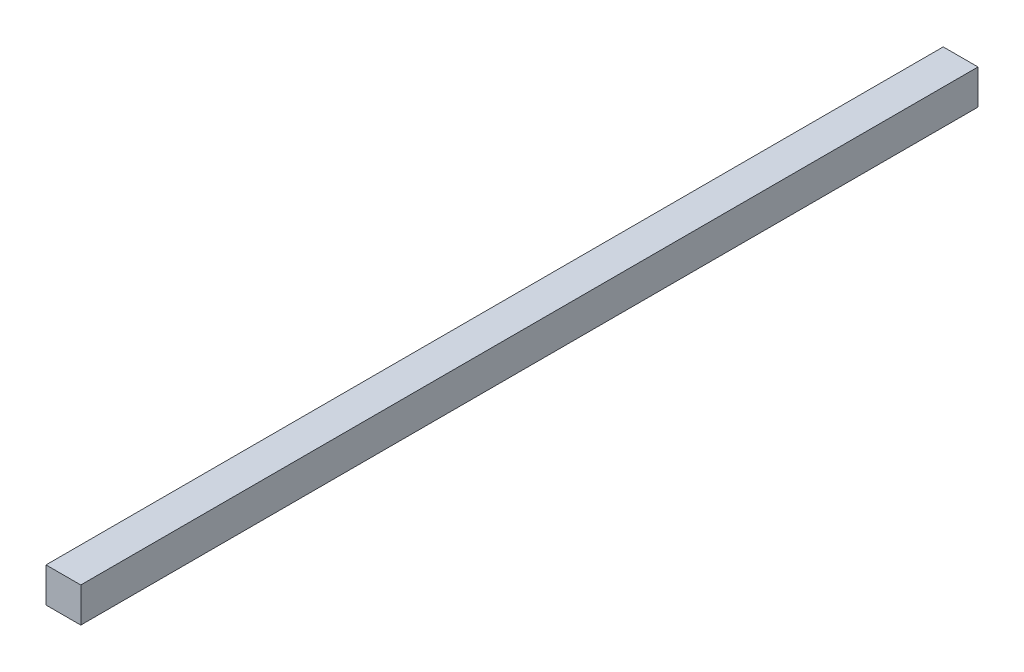
ISO-10303-21;
HEADER;
FILE_DESCRIPTION(('STEP AP214'),'2;1');
FILE_NAME('part.step','',(''),(''),'','','');
FILE_SCHEMA(('AUTOMOTIVE_DESIGN { 1 0 10303 214 1 1 1 1 }'));
ENDSEC;
DATA;
#1=APPLICATION_CONTEXT('core data for automotive mechanical design processes');
#2=APPLICATION_PROTOCOL_DEFINITION('international standard','automotive_design',2000,#1);
#3=PRODUCT_CONTEXT('',#1,'mechanical');
#4=PRODUCT('Part','Part','',(#3));
#5=PRODUCT_RELATED_PRODUCT_CATEGORY('part','',(#4));
#6=PRODUCT_DEFINITION_FORMATION('','',#4);
#7=PRODUCT_DEFINITION_CONTEXT('part definition',#1,'design');
#8=PRODUCT_DEFINITION('design','',#6,#7);
#9=PRODUCT_DEFINITION_SHAPE('','',#8);
#10=(LENGTH_UNIT() NAMED_UNIT(*) SI_UNIT(.MILLI.,.METRE.));
#11=(NAMED_UNIT(*) PLANE_ANGLE_UNIT() SI_UNIT($,.RADIAN.));
#12=(NAMED_UNIT(*) SI_UNIT($,.STERADIAN.) SOLID_ANGLE_UNIT());
#13=UNCERTAINTY_MEASURE_WITH_UNIT(LENGTH_MEASURE(1.E-05),#10,'distance_accuracy_value','');
#14=(GEOMETRIC_REPRESENTATION_CONTEXT(3) GLOBAL_UNCERTAINTY_ASSIGNED_CONTEXT((#13)) GLOBAL_UNIT_ASSIGNED_CONTEXT((#10,
#11,#12)) REPRESENTATION_CONTEXT('',''));
#15=CARTESIAN_POINT('',(0.,0.,0.));
#16=DIRECTION('',(0.,0.,1.));
#17=DIRECTION('',(1.,0.,0.));
#18=AXIS2_PLACEMENT_3D('',#15,#16,#17);
#19=CARTESIAN_POINT('',(-3.16326530612247,-1.73979591836735,400.));
#20=DIRECTION('',(1.,0.,0.));
#21=DIRECTION('',(0.,0.,-1.));
#22=AXIS2_PLACEMENT_3D('',#19,#20,#21);
#23=PLANE('',#22);
#24=DIRECTION('',(0.,-1.,0.));
#25=VECTOR('',#24,1.);
#26=CARTESIAN_POINT('',(-3.16326530612247,-1.73979591836735,0.));
#27=LINE('',#26,#25);
#28=CARTESIAN_POINT('',(-3.16326530612247,13.7602040816326,0.));
#29=VERTEX_POINT('',#28);
#30=CARTESIAN_POINT('',(-3.16326530612247,-1.73979591836735,0.));
#31=VERTEX_POINT('',#30);
#32=EDGE_CURVE('E107',#29,#31,#27,.T.);
#33=ORIENTED_EDGE('',*,*,#32,.T.);
#34=DIRECTION('',(0.,0.,-1.));
#35=VECTOR('',#34,1.);
#36=CARTESIAN_POINT('',(-3.16326530612247,-1.73979591836735,400.));
#37=LINE('',#36,#35);
#38=CARTESIAN_POINT('',(-3.16326530612247,-1.73979591836735,400.));
#39=VERTEX_POINT('',#38);
#40=EDGE_CURVE('E11',#39,#31,#37,.T.);
#41=ORIENTED_EDGE('',*,*,#40,.F.);
#42=DIRECTION('',(0.,-1.,0.));
#43=VECTOR('',#42,1.);
#44=CARTESIAN_POINT('',(-3.16326530612247,-1.73979591836735,400.));
#45=LINE('',#44,#43);
#46=CARTESIAN_POINT('',(-3.16326530612247,13.7602040816326,400.));
#47=VERTEX_POINT('',#46);
#48=EDGE_CURVE('E91',#47,#39,#45,.T.);
#49=ORIENTED_EDGE('',*,*,#48,.F.);
#50=DIRECTION('',(0.,0.,-1.));
#51=VECTOR('',#50,1.);
#52=CARTESIAN_POINT('',(-3.16326530612247,13.7602040816326,400.));
#53=LINE('',#52,#51);
#54=EDGE_CURVE('E103',#47,#29,#53,.T.);
#55=ORIENTED_EDGE('',*,*,#54,.T.);
#56=EDGE_LOOP('',(#33,#41,#49,#55));
#57=FACE_BOUND('',#56,.T.);
#58=ADVANCED_FACE('F39',(#57),#23,.F.);
#59=CARTESIAN_POINT('',(-3.16326530612247,-1.73979591836735,400.));
#60=DIRECTION('',(0.,1.,0.));
#61=DIRECTION('',(-1.,0.,0.));
#62=AXIS2_PLACEMENT_3D('',#59,#60,#61);
#63=PLANE('',#62);
#64=DIRECTION('',(1.,0.,0.));
#65=VECTOR('',#64,1.);
#66=CARTESIAN_POINT('',(-3.16326530612247,-1.73979591836735,0.));
#67=LINE('',#66,#65);
#68=CARTESIAN_POINT('',(12.3367346938775,-1.73979591836735,0.));
#69=VERTEX_POINT('',#68);
#70=EDGE_CURVE('E96',#31,#69,#67,.T.);
#71=ORIENTED_EDGE('',*,*,#70,.T.);
#72=DIRECTION('',(0.,0.,-1.));
#73=VECTOR('',#72,1.);
#74=CARTESIAN_POINT('',(12.3367346938775,-1.73979591836735,400.));
#75=LINE('',#74,#73);
#76=CARTESIAN_POINT('',(12.3367346938775,-1.73979591836735,400.));
#77=VERTEX_POINT('',#76);
#78=EDGE_CURVE('E48',#77,#69,#75,.T.);
#79=ORIENTED_EDGE('',*,*,#78,.F.);
#80=DIRECTION('',(1.,0.,0.));
#81=VECTOR('',#80,1.);
#82=CARTESIAN_POINT('',(-3.16326530612247,-1.73979591836735,400.));
#83=LINE('',#82,#81);
#84=EDGE_CURVE('E86',#39,#77,#83,.T.);
#85=ORIENTED_EDGE('',*,*,#84,.F.);
#86=ORIENTED_EDGE('',*,*,#40,.T.);
#87=EDGE_LOOP('',(#71,#79,#85,#86));
#88=FACE_BOUND('',#87,.T.);
#89=ADVANCED_FACE('F95',(#88),#63,.F.);
#90=CARTESIAN_POINT('',(12.3367346938775,-1.73979591836735,400.));
#91=DIRECTION('',(-1.,0.,0.));
#92=DIRECTION('',(0.,0.,1.));
#93=AXIS2_PLACEMENT_3D('',#90,#91,#92);
#94=PLANE('',#93);
#95=DIRECTION('',(0.,1.,0.));
#96=VECTOR('',#95,1.);
#97=CARTESIAN_POINT('',(12.3367346938775,-1.73979591836735,0.));
#98=LINE('',#97,#96);
#99=CARTESIAN_POINT('',(12.3367346938775,13.7602040816326,0.));
#100=VERTEX_POINT('',#99);
#101=EDGE_CURVE('E73',#69,#100,#98,.T.);
#102=ORIENTED_EDGE('',*,*,#101,.T.);
#103=DIRECTION('',(0.,0.,-1.));
#104=VECTOR('',#103,1.);
#105=CARTESIAN_POINT('',(12.3367346938775,13.7602040816326,400.));
#106=LINE('',#105,#104);
#107=CARTESIAN_POINT('',(12.3367346938775,13.7602040816326,400.));
#108=VERTEX_POINT('',#107);
#109=EDGE_CURVE('E98',#108,#100,#106,.T.);
#110=ORIENTED_EDGE('',*,*,#109,.F.);
#111=DIRECTION('',(0.,1.,0.));
#112=VECTOR('',#111,1.);
#113=CARTESIAN_POINT('',(12.3367346938775,-1.73979591836735,400.));
#114=LINE('',#113,#112);
#115=EDGE_CURVE('E89',#77,#108,#114,.T.);
#116=ORIENTED_EDGE('',*,*,#115,.F.);
#117=ORIENTED_EDGE('',*,*,#78,.T.);
#118=EDGE_LOOP('',(#102,#110,#116,#117));
#119=FACE_BOUND('',#118,.T.);
#120=ADVANCED_FACE('F99',(#119),#94,.F.);
#121=CARTESIAN_POINT('',(-3.16326530612247,13.7602040816326,400.));
#122=DIRECTION('',(0.,-1.,0.));
#123=DIRECTION('',(0.,0.,-1.));
#124=AXIS2_PLACEMENT_3D('',#121,#122,#123);
#125=PLANE('',#124);
#126=DIRECTION('',(-1.,0.,0.));
#127=VECTOR('',#126,1.);
#128=CARTESIAN_POINT('',(-3.16326530612247,13.7602040816326,0.));
#129=LINE('',#128,#127);
#130=EDGE_CURVE('E79',#100,#29,#129,.T.);
#131=ORIENTED_EDGE('',*,*,#130,.T.);
#132=ORIENTED_EDGE('',*,*,#54,.F.);
#133=DIRECTION('',(-1.,0.,0.));
#134=VECTOR('',#133,1.);
#135=CARTESIAN_POINT('',(-3.16326530612247,13.7602040816326,400.));
#136=LINE('',#135,#134);
#137=EDGE_CURVE('E56',#108,#47,#136,.T.);
#138=ORIENTED_EDGE('',*,*,#137,.F.);
#139=ORIENTED_EDGE('',*,*,#109,.T.);
#140=EDGE_LOOP('',(#131,#132,#138,#139));
#141=FACE_BOUND('',#140,.T.);
#142=ADVANCED_FACE('F120',(#141),#125,.F.);
#143=CARTESIAN_POINT('',(0.,0.,400.));
#144=DIRECTION('',(0.,0.,-1.));
#145=DIRECTION('',(-1.,0.,0.));
#146=AXIS2_PLACEMENT_3D('',#143,#144,#145);
#147=PLANE('',#146);
#148=ORIENTED_EDGE('',*,*,#48,.T.);
#149=ORIENTED_EDGE('',*,*,#84,.T.);
#150=ORIENTED_EDGE('',*,*,#115,.T.);
#151=ORIENTED_EDGE('',*,*,#137,.T.);
#152=EDGE_LOOP('',(#148,#149,#150,#151));
#153=FACE_BOUND('',#152,.T.);
#154=ADVANCED_FACE('F87',(#153),#147,.F.);
#155=CARTESIAN_POINT('',(0.,0.,0.));
#156=DIRECTION('',(0.,0.,-1.));
#157=DIRECTION('',(-1.,0.,0.));
#158=AXIS2_PLACEMENT_3D('',#155,#156,#157);
#159=PLANE('',#158);
#160=ORIENTED_EDGE('',*,*,#32,.F.);
#161=ORIENTED_EDGE('',*,*,#130,.F.);
#162=ORIENTED_EDGE('',*,*,#101,.F.);
#163=ORIENTED_EDGE('',*,*,#70,.F.);
#164=EDGE_LOOP('',(#160,#161,#162,#163));
#165=FACE_BOUND('',#164,.T.);
#166=ADVANCED_FACE('F123',(#165),#159,.T.);
#167=CLOSED_SHELL('',(#58,#89,#120,#142,#154,#166));
#168=MANIFOLD_SOLID_BREP('B2',#167);
#169=ADVANCED_BREP_SHAPE_REPRESENTATION('',(#18,#168),#14);
#170=SHAPE_DEFINITION_REPRESENTATION(#9,#169);
ENDSEC;
END-ISO-10303-21;
